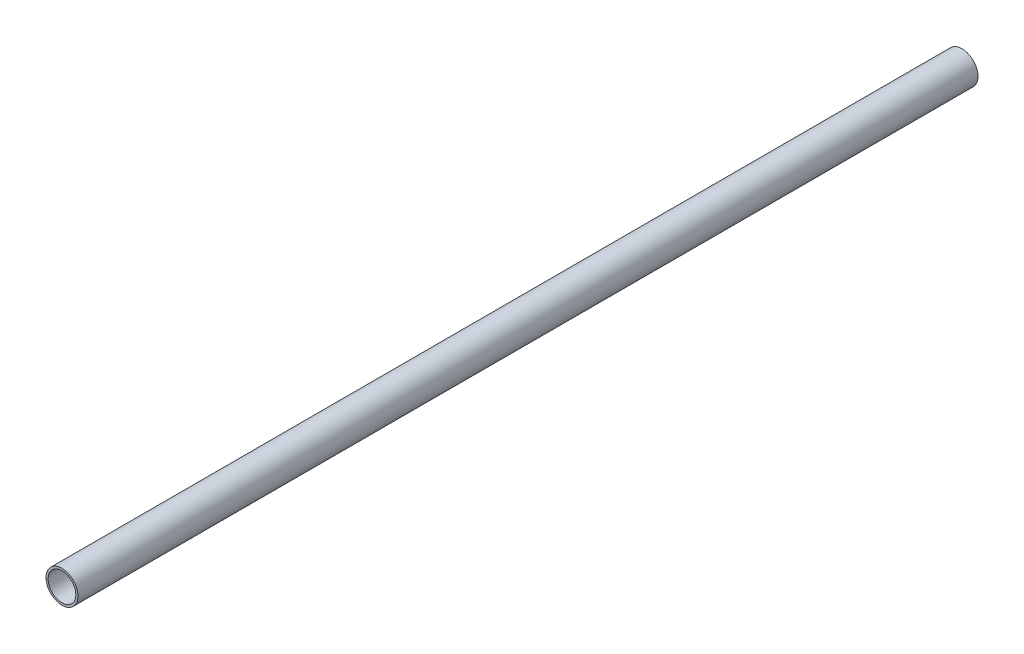
ISO-10303-21;
HEADER;
FILE_DESCRIPTION(('STEP AP214'),'2;1');
FILE_NAME('part.step','',(''),(''),'','','');
FILE_SCHEMA(('AUTOMOTIVE_DESIGN { 1 0 10303 214 1 1 1 1 }'));
ENDSEC;
DATA;
#1=APPLICATION_CONTEXT('core data for automotive mechanical design processes');
#2=APPLICATION_PROTOCOL_DEFINITION('international standard','automotive_design',2000,#1);
#3=PRODUCT_CONTEXT('',#1,'mechanical');
#4=PRODUCT('Part','Part','',(#3));
#5=PRODUCT_RELATED_PRODUCT_CATEGORY('part','',(#4));
#6=PRODUCT_DEFINITION_FORMATION('','',#4);
#7=PRODUCT_DEFINITION_CONTEXT('part definition',#1,'design');
#8=PRODUCT_DEFINITION('design','',#6,#7);
#9=PRODUCT_DEFINITION_SHAPE('','',#8);
#10=(LENGTH_UNIT() NAMED_UNIT(*) SI_UNIT(.MILLI.,.METRE.));
#11=(NAMED_UNIT(*) PLANE_ANGLE_UNIT() SI_UNIT($,.RADIAN.));
#12=(NAMED_UNIT(*) SI_UNIT($,.STERADIAN.) SOLID_ANGLE_UNIT());
#13=UNCERTAINTY_MEASURE_WITH_UNIT(LENGTH_MEASURE(1.E-05),#10,'distance_accuracy_value','');
#14=(GEOMETRIC_REPRESENTATION_CONTEXT(3) GLOBAL_UNCERTAINTY_ASSIGNED_CONTEXT((#13)) GLOBAL_UNIT_ASSIGNED_CONTEXT((#10,
#11,#12)) REPRESENTATION_CONTEXT('',''));
#15=CARTESIAN_POINT('',(0.,0.,0.));
#16=DIRECTION('',(0.,0.,1.));
#17=DIRECTION('',(1.,0.,0.));
#18=AXIS2_PLACEMENT_3D('',#15,#16,#17);
#19=CARTESIAN_POINT('',(0.,0.,422.));
#20=DIRECTION('',(0.,0.,1.));
#21=DIRECTION('',(1.,0.,0.));
#22=AXIS2_PLACEMENT_3D('',#19,#20,#21);
#23=PLANE('',#22);
#24=CARTESIAN_POINT('',(0.,0.,422.));
#25=DIRECTION('',(0.,0.,1.));
#26=DIRECTION('',(1.,0.,0.));
#27=AXIS2_PLACEMENT_3D('',#24,#25,#26);
#28=CIRCLE('',#27,7.5);
#29=CARTESIAN_POINT('',(7.5,0.,422.));
#30=VERTEX_POINT('',#29);
#31=EDGE_CURVE('E10',#30,#30,#28,.T.);
#32=ORIENTED_EDGE('',*,*,#31,.T.);
#33=EDGE_LOOP('',(#32));
#34=FACE_BOUND('',#33,.T.);
#35=CARTESIAN_POINT('',(0.,0.,422.));
#36=DIRECTION('',(0.,0.,1.));
#37=DIRECTION('',(1.,0.,0.));
#38=AXIS2_PLACEMENT_3D('',#35,#36,#37);
#39=CIRCLE('',#38,6.5);
#40=CARTESIAN_POINT('',(6.5,0.,422.));
#41=VERTEX_POINT('',#40);
#42=EDGE_CURVE('E42',#41,#41,#39,.T.);
#43=ORIENTED_EDGE('',*,*,#42,.F.);
#44=EDGE_LOOP('',(#43));
#45=FACE_BOUND('',#44,.T.);
#46=ADVANCED_FACE('F31',(#34,#45),#23,.T.);
#47=CARTESIAN_POINT('',(0.,0.,0.));
#48=DIRECTION('',(0.,0.,1.));
#49=DIRECTION('',(1.,0.,0.));
#50=AXIS2_PLACEMENT_3D('',#47,#48,#49);
#51=PLANE('',#50);
#52=CARTESIAN_POINT('',(0.,0.,0.));
#53=DIRECTION('',(0.,0.,1.));
#54=DIRECTION('',(1.,0.,0.));
#55=AXIS2_PLACEMENT_3D('',#52,#53,#54);
#56=CIRCLE('',#55,7.5);
#57=CARTESIAN_POINT('',(7.5,0.,0.));
#58=VERTEX_POINT('',#57);
#59=EDGE_CURVE('E35',#58,#58,#56,.T.);
#60=ORIENTED_EDGE('',*,*,#59,.F.);
#61=EDGE_LOOP('',(#60));
#62=FACE_BOUND('',#61,.T.);
#63=CARTESIAN_POINT('',(0.,0.,0.));
#64=DIRECTION('',(0.,0.,1.));
#65=DIRECTION('',(1.,0.,0.));
#66=AXIS2_PLACEMENT_3D('',#63,#64,#65);
#67=CIRCLE('',#66,6.5);
#68=CARTESIAN_POINT('',(6.5,0.,0.));
#69=VERTEX_POINT('',#68);
#70=EDGE_CURVE('E44',#69,#69,#67,.T.);
#71=ORIENTED_EDGE('',*,*,#70,.T.);
#72=EDGE_LOOP('',(#71));
#73=FACE_BOUND('',#72,.T.);
#74=ADVANCED_FACE('F54',(#62,#73),#51,.F.);
#75=CARTESIAN_POINT('',(0.,0.,422.));
#76=DIRECTION('',(0.,0.,-1.));
#77=DIRECTION('',(-1.,0.,0.));
#78=AXIS2_PLACEMENT_3D('',#75,#76,#77);
#79=CYLINDRICAL_SURFACE('',#78,7.5);
#80=ORIENTED_EDGE('',*,*,#31,.F.);
#81=EDGE_LOOP('',(#80));
#82=FACE_BOUND('',#81,.T.);
#83=ORIENTED_EDGE('',*,*,#59,.T.);
#84=EDGE_LOOP('',(#83));
#85=FACE_BOUND('',#84,.T.);
#86=ADVANCED_FACE('F33',(#82,#85),#79,.T.);
#87=CARTESIAN_POINT('',(0.,0.,422.));
#88=DIRECTION('',(0.,0.,-1.));
#89=DIRECTION('',(-1.,0.,0.));
#90=AXIS2_PLACEMENT_3D('',#87,#88,#89);
#91=CYLINDRICAL_SURFACE('',#90,6.5);
#92=ORIENTED_EDGE('',*,*,#42,.T.);
#93=EDGE_LOOP('',(#92));
#94=FACE_BOUND('',#93,.T.);
#95=ORIENTED_EDGE('',*,*,#70,.F.);
#96=EDGE_LOOP('',(#95));
#97=FACE_BOUND('',#96,.T.);
#98=ADVANCED_FACE('F50',(#94,#97),#91,.F.);
#99=CLOSED_SHELL('',(#46,#74,#86,#98));
#100=MANIFOLD_SOLID_BREP('B2',#99);
#101=ADVANCED_BREP_SHAPE_REPRESENTATION('',(#18,#100),#14);
#102=SHAPE_DEFINITION_REPRESENTATION(#9,#101);
ENDSEC;
END-ISO-10303-21;
